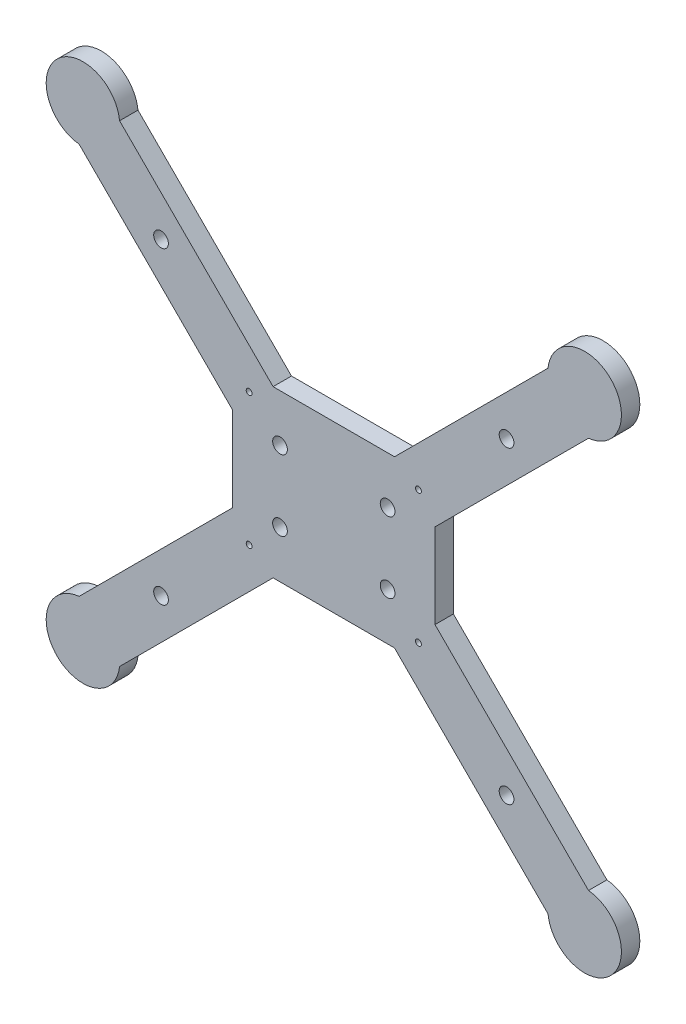
ISO-10303-21;
HEADER;
FILE_DESCRIPTION(('STEP AP214'),'2;1');
FILE_NAME('part.step','',(''),(''),'','','');
FILE_SCHEMA(('AUTOMOTIVE_DESIGN { 1 0 10303 214 1 1 1 1 }'));
ENDSEC;
DATA;
#1=APPLICATION_CONTEXT('core data for automotive mechanical design processes');
#2=APPLICATION_PROTOCOL_DEFINITION('international standard','automotive_design',2000,#1);
#3=PRODUCT_CONTEXT('',#1,'mechanical');
#4=PRODUCT('Part','Part','',(#3));
#5=PRODUCT_RELATED_PRODUCT_CATEGORY('part','',(#4));
#6=PRODUCT_DEFINITION_FORMATION('','',#4);
#7=PRODUCT_DEFINITION_CONTEXT('part definition',#1,'design');
#8=PRODUCT_DEFINITION('design','',#6,#7);
#9=PRODUCT_DEFINITION_SHAPE('','',#8);
#10=(LENGTH_UNIT() NAMED_UNIT(*) SI_UNIT(.MILLI.,.METRE.));
#11=(NAMED_UNIT(*) PLANE_ANGLE_UNIT() SI_UNIT($,.RADIAN.));
#12=(NAMED_UNIT(*) SI_UNIT($,.STERADIAN.) SOLID_ANGLE_UNIT());
#13=UNCERTAINTY_MEASURE_WITH_UNIT(LENGTH_MEASURE(1.E-05),#10,'distance_accuracy_value','');
#14=(GEOMETRIC_REPRESENTATION_CONTEXT(3) GLOBAL_UNCERTAINTY_ASSIGNED_CONTEXT((#13)) GLOBAL_UNIT_ASSIGNED_CONTEXT((#10,
#11,#12)) REPRESENTATION_CONTEXT('',''));
#15=CARTESIAN_POINT('',(0.,0.,0.));
#16=DIRECTION('',(0.,0.,1.));
#17=DIRECTION('',(1.,0.,0.));
#18=AXIS2_PLACEMENT_3D('',#15,#16,#17);
#19=CARTESIAN_POINT('',(55.,0.,10.));
#20=DIRECTION('',(-1.,0.,0.));
#21=DIRECTION('',(0.,0.,1.));
#22=AXIS2_PLACEMENT_3D('',#19,#20,#21);
#23=PLANE('',#22);
#24=DIRECTION('',(0.,1.,0.));
#25=VECTOR('',#24,1.);
#26=CARTESIAN_POINT('',(55.,0.,0.));
#27=LINE('',#26,#25);
#28=CARTESIAN_POINT('',(55.,-23.,0.));
#29=VERTEX_POINT('',#28);
#30=CARTESIAN_POINT('',(55.,23.,0.));
#31=VERTEX_POINT('',#30);
#32=EDGE_CURVE('E321',#29,#31,#27,.T.);
#33=ORIENTED_EDGE('',*,*,#32,.T.);
#34=DIRECTION('',(0.,0.,-1.));
#35=VECTOR('',#34,1.);
#36=CARTESIAN_POINT('',(55.,23.,10.));
#37=LINE('',#36,#35);
#38=CARTESIAN_POINT('',(55.,23.,10.));
#39=VERTEX_POINT('',#38);
#40=EDGE_CURVE('E194',#39,#31,#37,.T.);
#41=ORIENTED_EDGE('',*,*,#40,.F.);
#42=DIRECTION('',(0.,1.,0.));
#43=VECTOR('',#42,1.);
#44=CARTESIAN_POINT('',(55.,0.,10.));
#45=LINE('',#44,#43);
#46=CARTESIAN_POINT('',(55.,-23.,10.));
#47=VERTEX_POINT('',#46);
#48=EDGE_CURVE('E348',#47,#39,#45,.T.);
#49=ORIENTED_EDGE('',*,*,#48,.F.);
#50=DIRECTION('',(0.,0.,-1.));
#51=VECTOR('',#50,1.);
#52=CARTESIAN_POINT('',(55.,-23.,10.));
#53=LINE('',#52,#51);
#54=EDGE_CURVE('E377',#47,#29,#53,.T.);
#55=ORIENTED_EDGE('',*,*,#54,.T.);
#56=EDGE_LOOP('',(#33,#41,#49,#55));
#57=FACE_BOUND('',#56,.T.);
#58=ADVANCED_FACE('F175',(#57),#23,.F.);
#59=CARTESIAN_POINT('',(0.,45.,10.));
#60=DIRECTION('',(0.,-1.,0.));
#61=DIRECTION('',(1.,0.,0.));
#62=AXIS2_PLACEMENT_3D('',#59,#60,#61);
#63=PLANE('',#62);
#64=DIRECTION('',(-1.,0.,0.));
#65=VECTOR('',#64,1.);
#66=CARTESIAN_POINT('',(0.,45.,0.));
#67=LINE('',#66,#65);
#68=CARTESIAN_POINT('',(33.,45.,0.));
#69=VERTEX_POINT('',#68);
#70=CARTESIAN_POINT('',(-33.,45.,0.));
#71=VERTEX_POINT('',#70);
#72=EDGE_CURVE('E357',#69,#71,#67,.T.);
#73=ORIENTED_EDGE('',*,*,#72,.T.);
#74=DIRECTION('',(0.,0.,-1.));
#75=VECTOR('',#74,1.);
#76=CARTESIAN_POINT('',(-33.,45.,10.));
#77=LINE('',#76,#75);
#78=CARTESIAN_POINT('',(-33.,45.,10.));
#79=VERTEX_POINT('',#78);
#80=EDGE_CURVE('E393',#79,#71,#77,.T.);
#81=ORIENTED_EDGE('',*,*,#80,.F.);
#82=DIRECTION('',(-1.,0.,0.));
#83=VECTOR('',#82,1.);
#84=CARTESIAN_POINT('',(0.,45.,10.));
#85=LINE('',#84,#83);
#86=CARTESIAN_POINT('',(33.,45.,10.));
#87=VERTEX_POINT('',#86);
#88=EDGE_CURVE('E327',#87,#79,#85,.T.);
#89=ORIENTED_EDGE('',*,*,#88,.F.);
#90=DIRECTION('',(0.,0.,-1.));
#91=VECTOR('',#90,1.);
#92=CARTESIAN_POINT('',(33.,45.,10.));
#93=LINE('',#92,#91);
#94=EDGE_CURVE('E395',#87,#69,#93,.T.);
#95=ORIENTED_EDGE('',*,*,#94,.T.);
#96=EDGE_LOOP('',(#73,#81,#89,#95));
#97=FACE_BOUND('',#96,.T.);
#98=ADVANCED_FACE('F463',(#97),#63,.F.);
#99=CARTESIAN_POINT('',(15.9999999999997,-15.9999999999999,10.));
#100=DIRECTION('',(0.707106781186544,-0.707106781186551,0.));
#101=DIRECTION('',(0.707106781186551,0.707106781186544,0.));
#102=AXIS2_PLACEMENT_3D('',#99,#100,#101);
#103=PLANE('',#102);
#104=DIRECTION('',(-0.707106781186551,-0.707106781186544,0.));
#105=VECTOR('',#104,1.);
#106=CARTESIAN_POINT('',(15.9999999999997,-15.9999999999999,0.));
#107=LINE('',#106,#105);
#108=CARTESIAN_POINT('',(138.429085419138,106.429085419137,0.));
#109=VERTEX_POINT('',#108);
#110=EDGE_CURVE('E299',#109,#31,#107,.T.);
#111=ORIENTED_EDGE('',*,*,#110,.F.);
#112=DIRECTION('',(0.,0.,-1.));
#113=VECTOR('',#112,1.);
#114=CARTESIAN_POINT('',(138.429085419138,106.429085419137,10.));
#115=LINE('',#114,#113);
#116=CARTESIAN_POINT('',(138.429085419138,106.429085419137,10.));
#117=VERTEX_POINT('',#116);
#118=EDGE_CURVE('E12',#117,#109,#115,.T.);
#119=ORIENTED_EDGE('',*,*,#118,.F.);
#120=DIRECTION('',(-0.707106781186551,-0.707106781186544,0.));
#121=VECTOR('',#120,1.);
#122=CARTESIAN_POINT('',(15.9999999999997,-15.9999999999999,10.));
#123=LINE('',#122,#121);
#124=EDGE_CURVE('E317',#117,#39,#123,.T.);
#125=ORIENTED_EDGE('',*,*,#124,.T.);
#126=ORIENTED_EDGE('',*,*,#40,.T.);
#127=EDGE_LOOP('',(#111,#119,#125,#126));
#128=FACE_BOUND('',#127,.T.);
#129=ADVANCED_FACE('F436',(#128),#103,.T.);
#130=CARTESIAN_POINT('',(136.317279836453,126.317279836452,10.));
#131=DIRECTION('',(0.,0.,-1.));
#132=DIRECTION('',(-1.,0.,0.));
#133=AXIS2_PLACEMENT_3D('',#130,#131,#132);
#134=CYLINDRICAL_SURFACE('',#133,20.0000000000001);
#135=CARTESIAN_POINT('',(136.317279836453,126.317279836452,0.));
#136=DIRECTION('',(0.,0.,1.));
#137=DIRECTION('',(1.,0.,0.));
#138=AXIS2_PLACEMENT_3D('',#135,#136,#137);
#139=CIRCLE('',#138,20.0000000000001);
#140=CARTESIAN_POINT('',(116.429085419138,128.429085419137,0.));
#141=VERTEX_POINT('',#140);
#142=EDGE_CURVE('E351',#109,#141,#139,.T.);
#143=ORIENTED_EDGE('',*,*,#142,.T.);
#144=DIRECTION('',(0.,0.,-1.));
#145=VECTOR('',#144,1.);
#146=CARTESIAN_POINT('',(116.429085419138,128.429085419137,10.));
#147=LINE('',#146,#145);
#148=CARTESIAN_POINT('',(116.429085419138,128.429085419137,10.));
#149=VERTEX_POINT('',#148);
#150=EDGE_CURVE('E185',#149,#141,#147,.T.);
#151=ORIENTED_EDGE('',*,*,#150,.F.);
#152=CARTESIAN_POINT('',(136.317279836453,126.317279836452,10.));
#153=DIRECTION('',(0.,0.,1.));
#154=DIRECTION('',(1.,0.,0.));
#155=AXIS2_PLACEMENT_3D('',#152,#153,#154);
#156=CIRCLE('',#155,20.0000000000001);
#157=EDGE_CURVE('E320',#117,#149,#156,.T.);
#158=ORIENTED_EDGE('',*,*,#157,.F.);
#159=ORIENTED_EDGE('',*,*,#118,.T.);
#160=EDGE_LOOP('',(#143,#151,#158,#159));
#161=FACE_BOUND('',#160,.T.);
#162=ADVANCED_FACE('F443',(#161),#134,.T.);
#163=CARTESIAN_POINT('',(-6.00000000000019,6.00000000000025,10.));
#164=DIRECTION('',(-0.707106781186544,0.707106781186551,0.));
#165=DIRECTION('',(-0.707106781186551,-0.707106781186544,0.));
#166=AXIS2_PLACEMENT_3D('',#163,#164,#165);
#167=PLANE('',#166);
#168=DIRECTION('',(0.707106781186551,0.707106781186544,0.));
#169=VECTOR('',#168,1.);
#170=CARTESIAN_POINT('',(-6.00000000000019,6.00000000000025,0.));
#171=LINE('',#170,#169);
#172=EDGE_CURVE('E354',#69,#141,#171,.T.);
#173=ORIENTED_EDGE('',*,*,#172,.F.);
#174=ORIENTED_EDGE('',*,*,#94,.F.);
#175=DIRECTION('',(0.707106781186551,0.707106781186544,0.));
#176=VECTOR('',#175,1.);
#177=CARTESIAN_POINT('',(-6.00000000000019,6.00000000000025,10.));
#178=LINE('',#177,#176);
#179=EDGE_CURVE('E324',#87,#149,#178,.T.);
#180=ORIENTED_EDGE('',*,*,#179,.T.);
#181=ORIENTED_EDGE('',*,*,#150,.T.);
#182=EDGE_LOOP('',(#173,#174,#180,#181));
#183=FACE_BOUND('',#182,.T.);
#184=ADVANCED_FACE('F503',(#183),#167,.T.);
#185=CARTESIAN_POINT('',(0.,0.,0.));
#186=DIRECTION('',(0.,0.,1.));
#187=DIRECTION('',(1.,0.,0.));
#188=AXIS2_PLACEMENT_3D('',#185,#186,#187);
#189=PLANE('',#188);
#190=CARTESIAN_POINT('',(29.2383992870816,-19.2383992870817,0.));
#191=DIRECTION('',(0.,0.,-1.));
#192=DIRECTION('',(1.,0.,0.));
#193=AXIS2_PLACEMENT_3D('',#190,#191,#192);
#194=CIRCLE('',#193,3.99999999999979);
#195=CARTESIAN_POINT('',(33.2383992870814,-19.2383992870817,0.));
#196=VERTEX_POINT('',#195);
#197=EDGE_CURVE('E616',#196,#196,#194,.T.);
#198=ORIENTED_EDGE('',*,*,#197,.F.);
#199=EDGE_LOOP('',(#198));
#200=FACE_BOUND('',#199,.T.);
#201=CARTESIAN_POINT('',(-29.2383992870816,-19.2383992870817,0.));
#202=DIRECTION('',(0.,0.,-1.));
#203=DIRECTION('',(-1.,0.,0.));
#204=AXIS2_PLACEMENT_3D('',#201,#202,#203);
#205=CIRCLE('',#204,3.9999999999998);
#206=CARTESIAN_POINT('',(-33.2383992870814,-19.2383992870817,0.));
#207=VERTEX_POINT('',#206);
#208=EDGE_CURVE('E604',#207,#207,#205,.T.);
#209=ORIENTED_EDGE('',*,*,#208,.F.);
#210=EDGE_LOOP('',(#209));
#211=FACE_BOUND('',#210,.T.);
#212=CARTESIAN_POINT('',(-93.8908729652604,-83.8908729652599,0.));
#213=DIRECTION('',(0.,0.,-1.));
#214=DIRECTION('',(-1.,0.,0.));
#215=AXIS2_PLACEMENT_3D('',#212,#213,#214);
#216=CIRCLE('',#215,4.00000000000017);
#217=CARTESIAN_POINT('',(-97.8908729652606,-83.8908729652599,0.));
#218=VERTEX_POINT('',#217);
#219=EDGE_CURVE('E605',#218,#218,#216,.T.);
#220=ORIENTED_EDGE('',*,*,#219,.F.);
#221=EDGE_LOOP('',(#220));
#222=FACE_BOUND('',#221,.T.);
#223=CARTESIAN_POINT('',(46.,36.,0.));
#224=DIRECTION('',(0.,0.,-1.));
#225=DIRECTION('',(-1.,0.,0.));
#226=AXIS2_PLACEMENT_3D('',#223,#224,#225);
#227=CIRCLE('',#226,1.6);
#228=CARTESIAN_POINT('',(44.4,36.,0.));
#229=VERTEX_POINT('',#228);
#230=EDGE_CURVE('E587',#229,#229,#227,.T.);
#231=ORIENTED_EDGE('',*,*,#230,.F.);
#232=EDGE_LOOP('',(#231));
#233=FACE_BOUND('',#232,.T.);
#234=CARTESIAN_POINT('',(-29.2383992870816,19.2383992870817,0.));
#235=DIRECTION('',(0.,0.,-1.));
#236=DIRECTION('',(1.,0.,0.));
#237=AXIS2_PLACEMENT_3D('',#234,#235,#236);
#238=CIRCLE('',#237,3.9999999999998);
#239=CARTESIAN_POINT('',(-25.2383992870818,19.2383992870817,0.));
#240=VERTEX_POINT('',#239);
#241=EDGE_CURVE('E637',#240,#240,#238,.T.);
#242=ORIENTED_EDGE('',*,*,#241,.F.);
#243=EDGE_LOOP('',(#242));
#244=FACE_BOUND('',#243,.T.);
#245=CARTESIAN_POINT('',(93.8908729652604,-83.8908729652599,0.));
#246=DIRECTION('',(0.,0.,-1.));
#247=DIRECTION('',(1.,0.,0.));
#248=AXIS2_PLACEMENT_3D('',#245,#246,#247);
#249=CIRCLE('',#248,4.00000000000014);
#250=CARTESIAN_POINT('',(97.8908729652606,-83.8908729652599,0.));
#251=VERTEX_POINT('',#250);
#252=EDGE_CURVE('E314',#251,#251,#249,.T.);
#253=ORIENTED_EDGE('',*,*,#252,.F.);
#254=EDGE_LOOP('',(#253));
#255=FACE_BOUND('',#254,.T.);
#256=CARTESIAN_POINT('',(93.8908729652604,83.8908729652599,0.));
#257=DIRECTION('',(0.,0.,-1.));
#258=DIRECTION('',(-1.,0.,0.));
#259=AXIS2_PLACEMENT_3D('',#256,#257,#258);
#260=CIRCLE('',#259,4.00000000000014);
#261=CARTESIAN_POINT('',(89.8908729652603,83.8908729652599,0.));
#262=VERTEX_POINT('',#261);
#263=EDGE_CURVE('E627',#262,#262,#260,.T.);
#264=ORIENTED_EDGE('',*,*,#263,.F.);
#265=EDGE_LOOP('',(#264));
#266=FACE_BOUND('',#265,.T.);
#267=CARTESIAN_POINT('',(29.2383992870816,19.2383992870818,0.));
#268=DIRECTION('',(0.,0.,-1.));
#269=DIRECTION('',(-1.,0.,0.));
#270=AXIS2_PLACEMENT_3D('',#267,#268,#269);
#271=CIRCLE('',#270,3.99999999999974);
#272=CARTESIAN_POINT('',(25.2383992870818,19.2383992870818,0.));
#273=VERTEX_POINT('',#272);
#274=EDGE_CURVE('E615',#273,#273,#271,.T.);
#275=ORIENTED_EDGE('',*,*,#274,.F.);
#276=EDGE_LOOP('',(#275));
#277=FACE_BOUND('',#276,.T.);
#278=CARTESIAN_POINT('',(-46.,36.,0.));
#279=DIRECTION('',(0.,0.,-1.));
#280=DIRECTION('',(-1.,0.,0.));
#281=AXIS2_PLACEMENT_3D('',#278,#279,#280);
#282=CIRCLE('',#281,1.6);
#283=CARTESIAN_POINT('',(-47.6,36.,0.));
#284=VERTEX_POINT('',#283);
#285=EDGE_CURVE('E583',#284,#284,#282,.T.);
#286=ORIENTED_EDGE('',*,*,#285,.F.);
#287=EDGE_LOOP('',(#286));
#288=FACE_BOUND('',#287,.T.);
#289=CARTESIAN_POINT('',(-46.,-36.,0.));
#290=DIRECTION('',(0.,0.,-1.));
#291=DIRECTION('',(-1.,0.,0.));
#292=AXIS2_PLACEMENT_3D('',#289,#290,#291);
#293=CIRCLE('',#292,1.6);
#294=CARTESIAN_POINT('',(-47.6,-36.,0.));
#295=VERTEX_POINT('',#294);
#296=EDGE_CURVE('E590',#295,#295,#293,.T.);
#297=ORIENTED_EDGE('',*,*,#296,.F.);
#298=EDGE_LOOP('',(#297));
#299=FACE_BOUND('',#298,.T.);
#300=CARTESIAN_POINT('',(46.,-36.,0.));
#301=DIRECTION('',(0.,0.,-1.));
#302=DIRECTION('',(-1.,0.,0.));
#303=AXIS2_PLACEMENT_3D('',#300,#301,#302);
#304=CIRCLE('',#303,1.6);
#305=CARTESIAN_POINT('',(44.4,-36.,0.));
#306=VERTEX_POINT('',#305);
#307=EDGE_CURVE('E598',#306,#306,#304,.T.);
#308=ORIENTED_EDGE('',*,*,#307,.F.);
#309=EDGE_LOOP('',(#308));
#310=FACE_BOUND('',#309,.T.);
#311=CARTESIAN_POINT('',(-93.8908729652604,83.8908729652599,0.));
#312=DIRECTION('',(0.,0.,-1.));
#313=DIRECTION('',(1.,0.,0.));
#314=AXIS2_PLACEMENT_3D('',#311,#312,#313);
#315=CIRCLE('',#314,4.00000000000017);
#316=CARTESIAN_POINT('',(-89.8908729652603,83.8908729652599,0.));
#317=VERTEX_POINT('',#316);
#318=EDGE_CURVE('E306',#317,#317,#315,.T.);
#319=ORIENTED_EDGE('',*,*,#318,.F.);
#320=EDGE_LOOP('',(#319));
#321=FACE_BOUND('',#320,.T.);
#322=ORIENTED_EDGE('',*,*,#110,.T.);
#323=ORIENTED_EDGE('',*,*,#32,.F.);
#324=DIRECTION('',(-0.707106781186562,0.707106781186533,0.));
#325=VECTOR('',#324,1.);
#326=CARTESIAN_POINT('',(15.9999999999989,15.9999999999995,0.));
#327=LINE('',#326,#325);
#328=CARTESIAN_POINT('',(138.429085419139,-106.429085419136,0.));
#329=VERTEX_POINT('',#328);
#330=EDGE_CURVE('E372',#329,#29,#327,.T.);
#331=ORIENTED_EDGE('',*,*,#330,.F.);
#332=CARTESIAN_POINT('',(136.317279836455,-126.317279836451,0.));
#333=DIRECTION('',(0.,0.,1.));
#334=DIRECTION('',(1.,0.,0.));
#335=AXIS2_PLACEMENT_3D('',#332,#333,#334);
#336=CIRCLE('',#335,19.9999999999999);
#337=CARTESIAN_POINT('',(116.429085419139,-128.429085419136,0.));
#338=VERTEX_POINT('',#337);
#339=EDGE_CURVE('E370',#338,#329,#336,.T.);
#340=ORIENTED_EDGE('',*,*,#339,.F.);
#341=DIRECTION('',(0.707106781186562,-0.707106781186534,0.));
#342=VECTOR('',#341,1.);
#343=CARTESIAN_POINT('',(-6.00000000000065,-6.00000000000089,0.));
#344=LINE('',#343,#342);
#345=CARTESIAN_POINT('',(33.,-45.,0.));
#346=VERTEX_POINT('',#345);
#347=EDGE_CURVE('E368',#346,#338,#344,.T.);
#348=ORIENTED_EDGE('',*,*,#347,.F.);
#349=DIRECTION('',(-1.,0.,0.));
#350=VECTOR('',#349,1.);
#351=CARTESIAN_POINT('',(55.,-45.,0.));
#352=LINE('',#351,#350);
#353=CARTESIAN_POINT('',(-33.,-45.,0.));
#354=VERTEX_POINT('',#353);
#355=EDGE_CURVE('E179',#346,#354,#352,.T.);
#356=ORIENTED_EDGE('',*,*,#355,.T.);
#357=DIRECTION('',(0.707106781186551,0.707106781186544,0.));
#358=VECTOR('',#357,1.);
#359=CARTESIAN_POINT('',(6.00000000000016,-6.00000000000021,0.));
#360=LINE('',#359,#358);
#361=CARTESIAN_POINT('',(-116.429085419138,-128.429085419137,0.));
#362=VERTEX_POINT('',#361);
#363=EDGE_CURVE('E271',#362,#354,#360,.T.);
#364=ORIENTED_EDGE('',*,*,#363,.F.);
#365=CARTESIAN_POINT('',(-136.317279836453,-126.317279836453,0.));
#366=DIRECTION('',(0.,0.,1.));
#367=DIRECTION('',(1.,0.,0.));
#368=AXIS2_PLACEMENT_3D('',#365,#366,#367);
#369=CIRCLE('',#368,20.);
#370=CARTESIAN_POINT('',(-138.429085419138,-106.429085419137,0.));
#371=VERTEX_POINT('',#370);
#372=EDGE_CURVE('E277',#371,#362,#369,.T.);
#373=ORIENTED_EDGE('',*,*,#372,.F.);
#374=DIRECTION('',(-0.707106781186551,-0.707106781186544,0.));
#375=VECTOR('',#374,1.);
#376=CARTESIAN_POINT('',(-15.9999999999997,15.9999999999999,0.));
#377=LINE('',#376,#375);
#378=CARTESIAN_POINT('',(-55.,-23.,0.));
#379=VERTEX_POINT('',#378);
#380=EDGE_CURVE('E262',#379,#371,#377,.T.);
#381=ORIENTED_EDGE('',*,*,#380,.F.);
#382=DIRECTION('',(0.,1.,0.));
#383=VECTOR('',#382,1.);
#384=CARTESIAN_POINT('',(-55.,-45.,0.));
#385=LINE('',#384,#383);
#386=CARTESIAN_POINT('',(-55.,23.,0.));
#387=VERTEX_POINT('',#386);
#388=EDGE_CURVE('E301',#379,#387,#385,.T.);
#389=ORIENTED_EDGE('',*,*,#388,.T.);
#390=DIRECTION('',(-0.707106781186561,0.707106781186534,0.));
#391=VECTOR('',#390,1.);
#392=CARTESIAN_POINT('',(-15.9999999999989,-15.9999999999996,0.));
#393=LINE('',#392,#391);
#394=CARTESIAN_POINT('',(-138.429085419139,106.429085419136,0.));
#395=VERTEX_POINT('',#394);
#396=EDGE_CURVE('E366',#387,#395,#393,.T.);
#397=ORIENTED_EDGE('',*,*,#396,.T.);
#398=CARTESIAN_POINT('',(-136.317279836455,126.317279836451,0.));
#399=DIRECTION('',(0.,0.,1.));
#400=DIRECTION('',(1.,0.,0.));
#401=AXIS2_PLACEMENT_3D('',#398,#399,#400);
#402=CIRCLE('',#401,20.);
#403=CARTESIAN_POINT('',(-116.429085419139,128.429085419136,0.));
#404=VERTEX_POINT('',#403);
#405=EDGE_CURVE('E363',#404,#395,#402,.T.);
#406=ORIENTED_EDGE('',*,*,#405,.F.);
#407=DIRECTION('',(0.707106781186562,-0.707106781186534,0.));
#408=VECTOR('',#407,1.);
#409=CARTESIAN_POINT('',(6.00000000000064,6.00000000000088,0.));
#410=LINE('',#409,#408);
#411=EDGE_CURVE('E360',#404,#71,#410,.T.);
#412=ORIENTED_EDGE('',*,*,#411,.T.);
#413=ORIENTED_EDGE('',*,*,#72,.F.);
#414=ORIENTED_EDGE('',*,*,#172,.T.);
#415=ORIENTED_EDGE('',*,*,#142,.F.);
#416=EDGE_LOOP('',(#322,#323,#331,#340,#348,#356,#364,#373,#381,#389,#397,#406,#412,#413,#414,#415));
#417=FACE_BOUND('',#416,.T.);
#418=ADVANCED_FACE('F282',(#200,#211,#222,#233,#244,#255,#266,#277,#288,#299,#310,#321,#417),
#189,.F.);
#419=CARTESIAN_POINT('',(0.,0.,10.));
#420=DIRECTION('',(0.,0.,1.));
#421=DIRECTION('',(1.,0.,0.));
#422=AXIS2_PLACEMENT_3D('',#419,#420,#421);
#423=PLANE('',#422);
#424=CARTESIAN_POINT('',(29.2383992870816,-19.2383992870817,10.));
#425=DIRECTION('',(0.,0.,-1.));
#426=DIRECTION('',(1.,0.,0.));
#427=AXIS2_PLACEMENT_3D('',#424,#425,#426);
#428=CIRCLE('',#427,3.99999999999979);
#429=CARTESIAN_POINT('',(33.2383992870814,-19.2383992870817,10.));
#430=VERTEX_POINT('',#429);
#431=EDGE_CURVE('E613',#430,#430,#428,.T.);
#432=ORIENTED_EDGE('',*,*,#431,.T.);
#433=EDGE_LOOP('',(#432));
#434=FACE_BOUND('',#433,.T.);
#435=CARTESIAN_POINT('',(-29.2383992870816,-19.2383992870817,10.));
#436=DIRECTION('',(0.,0.,-1.));
#437=DIRECTION('',(-1.,0.,0.));
#438=AXIS2_PLACEMENT_3D('',#435,#436,#437);
#439=CIRCLE('',#438,3.9999999999998);
#440=CARTESIAN_POINT('',(-33.2383992870814,-19.2383992870817,10.));
#441=VERTEX_POINT('',#440);
#442=EDGE_CURVE('E619',#441,#441,#439,.T.);
#443=ORIENTED_EDGE('',*,*,#442,.T.);
#444=EDGE_LOOP('',(#443));
#445=FACE_BOUND('',#444,.T.);
#446=CARTESIAN_POINT('',(-93.8908729652604,-83.8908729652599,10.));
#447=DIRECTION('',(0.,0.,-1.));
#448=DIRECTION('',(-1.,0.,0.));
#449=AXIS2_PLACEMENT_3D('',#446,#447,#448);
#450=CIRCLE('',#449,4.00000000000017);
#451=CARTESIAN_POINT('',(-97.8908729652606,-83.8908729652599,10.));
#452=VERTEX_POINT('',#451);
#453=EDGE_CURVE('E601',#452,#452,#450,.T.);
#454=ORIENTED_EDGE('',*,*,#453,.T.);
#455=EDGE_LOOP('',(#454));
#456=FACE_BOUND('',#455,.T.);
#457=CARTESIAN_POINT('',(46.,36.,10.));
#458=DIRECTION('',(0.,0.,-1.));
#459=DIRECTION('',(-1.,0.,0.));
#460=AXIS2_PLACEMENT_3D('',#457,#458,#459);
#461=CIRCLE('',#460,1.6);
#462=CARTESIAN_POINT('',(44.4,36.,10.));
#463=VERTEX_POINT('',#462);
#464=EDGE_CURVE('E608',#463,#463,#461,.T.);
#465=ORIENTED_EDGE('',*,*,#464,.T.);
#466=EDGE_LOOP('',(#465));
#467=FACE_BOUND('',#466,.T.);
#468=CARTESIAN_POINT('',(-29.2383992870816,19.2383992870817,10.));
#469=DIRECTION('',(0.,0.,-1.));
#470=DIRECTION('',(1.,0.,0.));
#471=AXIS2_PLACEMENT_3D('',#468,#469,#470);
#472=CIRCLE('',#471,3.9999999999998);
#473=CARTESIAN_POINT('',(-25.2383992870818,19.2383992870817,10.));
#474=VERTEX_POINT('',#473);
#475=EDGE_CURVE('E311',#474,#474,#472,.T.);
#476=ORIENTED_EDGE('',*,*,#475,.T.);
#477=EDGE_LOOP('',(#476));
#478=FACE_BOUND('',#477,.T.);
#479=CARTESIAN_POINT('',(93.8908729652604,-83.8908729652599,10.));
#480=DIRECTION('',(0.,0.,-1.));
#481=DIRECTION('',(1.,0.,0.));
#482=AXIS2_PLACEMENT_3D('',#479,#480,#481);
#483=CIRCLE('',#482,4.00000000000014);
#484=CARTESIAN_POINT('',(97.8908729652606,-83.8908729652599,10.));
#485=VERTEX_POINT('',#484);
#486=EDGE_CURVE('E639',#485,#485,#483,.T.);
#487=ORIENTED_EDGE('',*,*,#486,.T.);
#488=EDGE_LOOP('',(#487));
#489=FACE_BOUND('',#488,.T.);
#490=CARTESIAN_POINT('',(93.8908729652604,83.8908729652599,10.));
#491=DIRECTION('',(0.,0.,-1.));
#492=DIRECTION('',(-1.,0.,0.));
#493=AXIS2_PLACEMENT_3D('',#490,#491,#492);
#494=CIRCLE('',#493,4.00000000000014);
#495=CARTESIAN_POINT('',(89.8908729652603,83.8908729652599,10.));
#496=VERTEX_POINT('',#495);
#497=EDGE_CURVE('E624',#496,#496,#494,.T.);
#498=ORIENTED_EDGE('',*,*,#497,.T.);
#499=EDGE_LOOP('',(#498));
#500=FACE_BOUND('',#499,.T.);
#501=CARTESIAN_POINT('',(29.2383992870816,19.2383992870818,10.));
#502=DIRECTION('',(0.,0.,-1.));
#503=DIRECTION('',(-1.,0.,0.));
#504=AXIS2_PLACEMENT_3D('',#501,#502,#503);
#505=CIRCLE('',#504,3.99999999999974);
#506=CARTESIAN_POINT('',(25.2383992870818,19.2383992870818,10.));
#507=VERTEX_POINT('',#506);
#508=EDGE_CURVE('E630',#507,#507,#505,.T.);
#509=ORIENTED_EDGE('',*,*,#508,.T.);
#510=EDGE_LOOP('',(#509));
#511=FACE_BOUND('',#510,.T.);
#512=CARTESIAN_POINT('',(-46.,36.,10.));
#513=DIRECTION('',(0.,0.,-1.));
#514=DIRECTION('',(-1.,0.,0.));
#515=AXIS2_PLACEMENT_3D('',#512,#513,#514);
#516=CIRCLE('',#515,1.6);
#517=CARTESIAN_POINT('',(-47.6,36.,10.));
#518=VERTEX_POINT('',#517);
#519=EDGE_CURVE('E580',#518,#518,#516,.T.);
#520=ORIENTED_EDGE('',*,*,#519,.T.);
#521=EDGE_LOOP('',(#520));
#522=FACE_BOUND('',#521,.T.);
#523=CARTESIAN_POINT('',(-46.,-36.,10.));
#524=DIRECTION('',(0.,0.,-1.));
#525=DIRECTION('',(-1.,0.,0.));
#526=AXIS2_PLACEMENT_3D('',#523,#524,#525);
#527=CIRCLE('',#526,1.6);
#528=CARTESIAN_POINT('',(-47.6,-36.,10.));
#529=VERTEX_POINT('',#528);
#530=EDGE_CURVE('E585',#529,#529,#527,.T.);
#531=ORIENTED_EDGE('',*,*,#530,.T.);
#532=EDGE_LOOP('',(#531));
#533=FACE_BOUND('',#532,.T.);
#534=CARTESIAN_POINT('',(46.,-36.,10.));
#535=DIRECTION('',(0.,0.,-1.));
#536=DIRECTION('',(-1.,0.,0.));
#537=AXIS2_PLACEMENT_3D('',#534,#535,#536);
#538=CIRCLE('',#537,1.6);
#539=CARTESIAN_POINT('',(44.4,-36.,10.));
#540=VERTEX_POINT('',#539);
#541=EDGE_CURVE('E595',#540,#540,#538,.T.);
#542=ORIENTED_EDGE('',*,*,#541,.T.);
#543=EDGE_LOOP('',(#542));
#544=FACE_BOUND('',#543,.T.);
#545=CARTESIAN_POINT('',(-93.8908729652604,83.8908729652599,10.));
#546=DIRECTION('',(0.,0.,-1.));
#547=DIRECTION('',(1.,0.,0.));
#548=AXIS2_PLACEMENT_3D('',#545,#546,#547);
#549=CIRCLE('',#548,4.00000000000017);
#550=CARTESIAN_POINT('',(-89.8908729652603,83.8908729652599,10.));
#551=VERTEX_POINT('',#550);
#552=EDGE_CURVE('E302',#551,#551,#549,.T.);
#553=ORIENTED_EDGE('',*,*,#552,.T.);
#554=EDGE_LOOP('',(#553));
#555=FACE_BOUND('',#554,.T.);
#556=ORIENTED_EDGE('',*,*,#179,.F.);
#557=ORIENTED_EDGE('',*,*,#88,.T.);
#558=DIRECTION('',(0.707106781186562,-0.707106781186534,0.));
#559=VECTOR('',#558,1.);
#560=CARTESIAN_POINT('',(6.00000000000064,6.00000000000088,10.));
#561=LINE('',#560,#559);
#562=CARTESIAN_POINT('',(-116.429085419139,128.429085419136,10.));
#563=VERTEX_POINT('',#562);
#564=EDGE_CURVE('E330',#563,#79,#561,.T.);
#565=ORIENTED_EDGE('',*,*,#564,.F.);
#566=CARTESIAN_POINT('',(-136.317279836455,126.317279836451,10.));
#567=DIRECTION('',(0.,0.,1.));
#568=DIRECTION('',(1.,0.,0.));
#569=AXIS2_PLACEMENT_3D('',#566,#567,#568);
#570=CIRCLE('',#569,20.);
#571=CARTESIAN_POINT('',(-138.429085419139,106.429085419136,10.));
#572=VERTEX_POINT('',#571);
#573=EDGE_CURVE('E333',#563,#572,#570,.T.);
#574=ORIENTED_EDGE('',*,*,#573,.T.);
#575=DIRECTION('',(-0.707106781186561,0.707106781186534,0.));
#576=VECTOR('',#575,1.);
#577=CARTESIAN_POINT('',(-15.9999999999989,-15.9999999999996,10.));
#578=LINE('',#577,#576);
#579=CARTESIAN_POINT('',(-55.,23.,10.));
#580=VERTEX_POINT('',#579);
#581=EDGE_CURVE('E336',#580,#572,#578,.T.);
#582=ORIENTED_EDGE('',*,*,#581,.F.);
#583=DIRECTION('',(0.,1.,0.));
#584=VECTOR('',#583,1.);
#585=CARTESIAN_POINT('',(-55.,-45.,10.));
#586=LINE('',#585,#584);
#587=CARTESIAN_POINT('',(-55.,-23.,10.));
#588=VERTEX_POINT('',#587);
#589=EDGE_CURVE('E288',#588,#580,#586,.T.);
#590=ORIENTED_EDGE('',*,*,#589,.F.);
#591=DIRECTION('',(-0.707106781186551,-0.707106781186544,0.));
#592=VECTOR('',#591,1.);
#593=CARTESIAN_POINT('',(-15.9999999999997,15.9999999999999,10.));
#594=LINE('',#593,#592);
#595=CARTESIAN_POINT('',(-138.429085419138,-106.429085419137,10.));
#596=VERTEX_POINT('',#595);
#597=EDGE_CURVE('E279',#588,#596,#594,.T.);
#598=ORIENTED_EDGE('',*,*,#597,.T.);
#599=CARTESIAN_POINT('',(-136.317279836453,-126.317279836453,10.));
#600=DIRECTION('',(0.,0.,1.));
#601=DIRECTION('',(1.,0.,0.));
#602=AXIS2_PLACEMENT_3D('',#599,#600,#601);
#603=CIRCLE('',#602,20.);
#604=CARTESIAN_POINT('',(-116.429085419138,-128.429085419137,10.));
#605=VERTEX_POINT('',#604);
#606=EDGE_CURVE('E270',#596,#605,#603,.T.);
#607=ORIENTED_EDGE('',*,*,#606,.T.);
#608=DIRECTION('',(0.707106781186551,0.707106781186544,0.));
#609=VECTOR('',#608,1.);
#610=CARTESIAN_POINT('',(6.00000000000016,-6.00000000000021,10.));
#611=LINE('',#610,#609);
#612=CARTESIAN_POINT('',(-33.,-45.,10.));
#613=VERTEX_POINT('',#612);
#614=EDGE_CURVE('E398',#605,#613,#611,.T.);
#615=ORIENTED_EDGE('',*,*,#614,.T.);
#616=DIRECTION('',(-1.,0.,0.));
#617=VECTOR('',#616,1.);
#618=CARTESIAN_POINT('',(55.,-45.,10.));
#619=LINE('',#618,#617);
#620=CARTESIAN_POINT('',(33.,-45.,10.));
#621=VERTEX_POINT('',#620);
#622=EDGE_CURVE('E285',#621,#613,#619,.T.);
#623=ORIENTED_EDGE('',*,*,#622,.F.);
#624=DIRECTION('',(0.707106781186562,-0.707106781186534,0.));
#625=VECTOR('',#624,1.);
#626=CARTESIAN_POINT('',(-6.00000000000065,-6.00000000000089,10.));
#627=LINE('',#626,#625);
#628=CARTESIAN_POINT('',(116.429085419139,-128.429085419136,10.));
#629=VERTEX_POINT('',#628);
#630=EDGE_CURVE('E339',#621,#629,#627,.T.);
#631=ORIENTED_EDGE('',*,*,#630,.T.);
#632=CARTESIAN_POINT('',(136.317279836455,-126.317279836451,10.));
#633=DIRECTION('',(0.,0.,1.));
#634=DIRECTION('',(1.,0.,0.));
#635=AXIS2_PLACEMENT_3D('',#632,#633,#634);
#636=CIRCLE('',#635,19.9999999999999);
#637=CARTESIAN_POINT('',(138.429085419139,-106.429085419136,10.));
#638=VERTEX_POINT('',#637);
#639=EDGE_CURVE('E342',#629,#638,#636,.T.);
#640=ORIENTED_EDGE('',*,*,#639,.T.);
#641=DIRECTION('',(-0.707106781186562,0.707106781186533,0.));
#642=VECTOR('',#641,1.);
#643=CARTESIAN_POINT('',(15.9999999999989,15.9999999999995,10.));
#644=LINE('',#643,#642);
#645=EDGE_CURVE('E345',#638,#47,#644,.T.);
#646=ORIENTED_EDGE('',*,*,#645,.T.);
#647=ORIENTED_EDGE('',*,*,#48,.T.);
#648=ORIENTED_EDGE('',*,*,#124,.F.);
#649=ORIENTED_EDGE('',*,*,#157,.T.);
#650=EDGE_LOOP('',(#556,#557,#565,#574,#582,#590,#598,#607,#615,#623,#631,#640,#646,#647,#648,#649));
#651=FACE_BOUND('',#650,.T.);
#652=ADVANCED_FACE('F404',(#434,#445,#456,#467,#478,#489,#500,#511,#522,#533,#544,#555,#651),
#423,.T.);
#653=CARTESIAN_POINT('',(-136.317279836455,126.317279836451,10.));
#654=DIRECTION('',(0.,0.,-1.));
#655=DIRECTION('',(-1.,0.,0.));
#656=AXIS2_PLACEMENT_3D('',#653,#654,#655);
#657=CYLINDRICAL_SURFACE('',#656,20.);
#658=ORIENTED_EDGE('',*,*,#405,.T.);
#659=DIRECTION('',(0.,0.,-1.));
#660=VECTOR('',#659,1.);
#661=CARTESIAN_POINT('',(-138.429085419139,106.429085419136,10.));
#662=LINE('',#661,#660);
#663=EDGE_CURVE('E389',#572,#395,#662,.T.);
#664=ORIENTED_EDGE('',*,*,#663,.F.);
#665=ORIENTED_EDGE('',*,*,#573,.F.);
#666=DIRECTION('',(0.,0.,-1.));
#667=VECTOR('',#666,1.);
#668=CARTESIAN_POINT('',(-116.429085419139,128.429085419136,10.));
#669=LINE('',#668,#667);
#670=EDGE_CURVE('E391',#563,#404,#669,.T.);
#671=ORIENTED_EDGE('',*,*,#670,.T.);
#672=EDGE_LOOP('',(#658,#664,#665,#671));
#673=FACE_BOUND('',#672,.T.);
#674=ADVANCED_FACE('F460',(#673),#657,.T.);
#675=CARTESIAN_POINT('',(-15.9999999999989,-15.9999999999996,10.));
#676=DIRECTION('',(-0.707106781186534,-0.707106781186561,0.));
#677=DIRECTION('',(0.707106781186561,-0.707106781186534,0.));
#678=AXIS2_PLACEMENT_3D('',#675,#676,#677);
#679=PLANE('',#678);
#680=ORIENTED_EDGE('',*,*,#396,.F.);
#681=DIRECTION('',(0.,0.,-1.));
#682=VECTOR('',#681,1.);
#683=CARTESIAN_POINT('',(-55.,23.,10.));
#684=LINE('',#683,#682);
#685=EDGE_CURVE('E387',#580,#387,#684,.T.);
#686=ORIENTED_EDGE('',*,*,#685,.F.);
#687=ORIENTED_EDGE('',*,*,#581,.T.);
#688=ORIENTED_EDGE('',*,*,#663,.T.);
#689=EDGE_LOOP('',(#680,#686,#687,#688));
#690=FACE_BOUND('',#689,.T.);
#691=ADVANCED_FACE('F466',(#690),#679,.T.);
#692=CARTESIAN_POINT('',(6.00000000000064,6.00000000000088,10.));
#693=DIRECTION('',(0.707106781186534,0.707106781186562,0.));
#694=DIRECTION('',(-0.707106781186562,0.707106781186534,0.));
#695=AXIS2_PLACEMENT_3D('',#692,#693,#694);
#696=PLANE('',#695);
#697=ORIENTED_EDGE('',*,*,#411,.F.);
#698=ORIENTED_EDGE('',*,*,#670,.F.);
#699=ORIENTED_EDGE('',*,*,#564,.T.);
#700=ORIENTED_EDGE('',*,*,#80,.T.);
#701=EDGE_LOOP('',(#697,#698,#699,#700));
#702=FACE_BOUND('',#701,.T.);
#703=ADVANCED_FACE('F455',(#702),#696,.T.);
#704=CARTESIAN_POINT('',(-6.00000000000065,-6.00000000000089,10.));
#705=DIRECTION('',(0.707106781186534,0.707106781186562,0.));
#706=DIRECTION('',(-0.707106781186562,0.707106781186534,0.));
#707=AXIS2_PLACEMENT_3D('',#704,#705,#706);
#708=PLANE('',#707);
#709=ORIENTED_EDGE('',*,*,#347,.T.);
#710=DIRECTION('',(0.,0.,-1.));
#711=VECTOR('',#710,1.);
#712=CARTESIAN_POINT('',(116.429085419139,-128.429085419136,10.));
#713=LINE('',#712,#711);
#714=EDGE_CURVE('E382',#629,#338,#713,.T.);
#715=ORIENTED_EDGE('',*,*,#714,.F.);
#716=ORIENTED_EDGE('',*,*,#630,.F.);
#717=DIRECTION('',(0.,0.,-1.));
#718=VECTOR('',#717,1.);
#719=CARTESIAN_POINT('',(33.,-45.,10.));
#720=LINE('',#719,#718);
#721=EDGE_CURVE('E385',#621,#346,#720,.T.);
#722=ORIENTED_EDGE('',*,*,#721,.T.);
#723=EDGE_LOOP('',(#709,#715,#716,#722));
#724=FACE_BOUND('',#723,.T.);
#725=ADVANCED_FACE('F473',(#724),#708,.F.);
#726=CARTESIAN_POINT('',(136.317279836455,-126.317279836451,10.));
#727=DIRECTION('',(0.,0.,-1.));
#728=DIRECTION('',(-1.,0.,0.));
#729=AXIS2_PLACEMENT_3D('',#726,#727,#728);
#730=CYLINDRICAL_SURFACE('',#729,19.9999999999999);
#731=ORIENTED_EDGE('',*,*,#339,.T.);
#732=DIRECTION('',(0.,0.,-1.));
#733=VECTOR('',#732,1.);
#734=CARTESIAN_POINT('',(138.429085419139,-106.429085419136,10.));
#735=LINE('',#734,#733);
#736=EDGE_CURVE('E379',#638,#329,#735,.T.);
#737=ORIENTED_EDGE('',*,*,#736,.F.);
#738=ORIENTED_EDGE('',*,*,#639,.F.);
#739=ORIENTED_EDGE('',*,*,#714,.T.);
#740=EDGE_LOOP('',(#731,#737,#738,#739));
#741=FACE_BOUND('',#740,.T.);
#742=ADVANCED_FACE('F426',(#741),#730,.T.);
#743=CARTESIAN_POINT('',(15.9999999999989,15.9999999999995,10.));
#744=DIRECTION('',(-0.707106781186533,-0.707106781186562,0.));
#745=DIRECTION('',(0.707106781186562,-0.707106781186533,0.));
#746=AXIS2_PLACEMENT_3D('',#743,#744,#745);
#747=PLANE('',#746);
#748=ORIENTED_EDGE('',*,*,#330,.T.);
#749=ORIENTED_EDGE('',*,*,#54,.F.);
#750=ORIENTED_EDGE('',*,*,#645,.F.);
#751=ORIENTED_EDGE('',*,*,#736,.T.);
#752=EDGE_LOOP('',(#748,#749,#750,#751));
#753=FACE_BOUND('',#752,.T.);
#754=ADVANCED_FACE('F430',(#753),#747,.F.);
#755=CARTESIAN_POINT('',(-136.317279836453,-126.317279836453,10.));
#756=DIRECTION('',(0.,0.,-1.));
#757=DIRECTION('',(-1.,0.,0.));
#758=AXIS2_PLACEMENT_3D('',#755,#756,#757);
#759=CYLINDRICAL_SURFACE('',#758,20.);
#760=ORIENTED_EDGE('',*,*,#372,.T.);
#761=DIRECTION('',(0.,0.,-1.));
#762=VECTOR('',#761,1.);
#763=CARTESIAN_POINT('',(-116.429085419138,-128.429085419137,10.));
#764=LINE('',#763,#762);
#765=EDGE_CURVE('E297',#605,#362,#764,.T.);
#766=ORIENTED_EDGE('',*,*,#765,.F.);
#767=ORIENTED_EDGE('',*,*,#606,.F.);
#768=DIRECTION('',(0.,0.,-1.));
#769=VECTOR('',#768,1.);
#770=CARTESIAN_POINT('',(-138.429085419138,-106.429085419137,10.));
#771=LINE('',#770,#769);
#772=EDGE_CURVE('E265',#596,#371,#771,.T.);
#773=ORIENTED_EDGE('',*,*,#772,.T.);
#774=EDGE_LOOP('',(#760,#766,#767,#773));
#775=FACE_BOUND('',#774,.T.);
#776=ADVANCED_FACE('F275',(#775),#759,.T.);
#777=CARTESIAN_POINT('',(-15.9999999999997,15.9999999999999,10.));
#778=DIRECTION('',(0.707106781186544,-0.707106781186551,0.));
#779=DIRECTION('',(0.707106781186551,0.707106781186544,0.));
#780=AXIS2_PLACEMENT_3D('',#777,#778,#779);
#781=PLANE('',#780);
#782=ORIENTED_EDGE('',*,*,#380,.T.);
#783=ORIENTED_EDGE('',*,*,#772,.F.);
#784=ORIENTED_EDGE('',*,*,#597,.F.);
#785=DIRECTION('',(0.,0.,-1.));
#786=VECTOR('',#785,1.);
#787=CARTESIAN_POINT('',(-55.,-23.,10.));
#788=LINE('',#787,#786);
#789=EDGE_CURVE('E258',#588,#379,#788,.T.);
#790=ORIENTED_EDGE('',*,*,#789,.T.);
#791=EDGE_LOOP('',(#782,#783,#784,#790));
#792=FACE_BOUND('',#791,.T.);
#793=ADVANCED_FACE('F264',(#792),#781,.F.);
#794=CARTESIAN_POINT('',(6.00000000000016,-6.00000000000021,10.));
#795=DIRECTION('',(-0.707106781186544,0.707106781186551,0.));
#796=DIRECTION('',(-0.707106781186551,-0.707106781186544,0.));
#797=AXIS2_PLACEMENT_3D('',#794,#795,#796);
#798=PLANE('',#797);
#799=ORIENTED_EDGE('',*,*,#363,.T.);
#800=DIRECTION('',(0.,0.,-1.));
#801=VECTOR('',#800,1.);
#802=CARTESIAN_POINT('',(-33.,-45.,10.));
#803=LINE('',#802,#801);
#804=EDGE_CURVE('E294',#613,#354,#803,.T.);
#805=ORIENTED_EDGE('',*,*,#804,.F.);
#806=ORIENTED_EDGE('',*,*,#614,.F.);
#807=ORIENTED_EDGE('',*,*,#765,.T.);
#808=EDGE_LOOP('',(#799,#805,#806,#807));
#809=FACE_BOUND('',#808,.T.);
#810=ADVANCED_FACE('F484',(#809),#798,.F.);
#811=CARTESIAN_POINT('',(-55.,-45.,10.));
#812=DIRECTION('',(-1.,0.,0.));
#813=DIRECTION('',(0.,0.,1.));
#814=AXIS2_PLACEMENT_3D('',#811,#812,#813);
#815=PLANE('',#814);
#816=ORIENTED_EDGE('',*,*,#589,.T.);
#817=ORIENTED_EDGE('',*,*,#685,.T.);
#818=ORIENTED_EDGE('',*,*,#388,.F.);
#819=ORIENTED_EDGE('',*,*,#789,.F.);
#820=EDGE_LOOP('',(#816,#817,#818,#819));
#821=FACE_BOUND('',#820,.T.);
#822=ADVANCED_FACE('F177',(#821),#815,.T.);
#823=CARTESIAN_POINT('',(55.,-45.,10.));
#824=DIRECTION('',(0.,-1.,0.));
#825=DIRECTION('',(1.,0.,0.));
#826=AXIS2_PLACEMENT_3D('',#823,#824,#825);
#827=PLANE('',#826);
#828=ORIENTED_EDGE('',*,*,#721,.F.);
#829=ORIENTED_EDGE('',*,*,#622,.T.);
#830=ORIENTED_EDGE('',*,*,#804,.T.);
#831=ORIENTED_EDGE('',*,*,#355,.F.);
#832=EDGE_LOOP('',(#828,#829,#830,#831));
#833=FACE_BOUND('',#832,.T.);
#834=ADVANCED_FACE('F476',(#833),#827,.T.);
#835=CARTESIAN_POINT('',(-93.8908729652604,83.8908729652599,10.));
#836=DIRECTION('',(0.,0.,-1.));
#837=DIRECTION('',(-1.,0.,0.));
#838=AXIS2_PLACEMENT_3D('',#835,#836,#837);
#839=CYLINDRICAL_SURFACE('',#838,4.00000000000017);
#840=ORIENTED_EDGE('',*,*,#552,.F.);
#841=EDGE_LOOP('',(#840));
#842=FACE_BOUND('',#841,.T.);
#843=ORIENTED_EDGE('',*,*,#318,.T.);
#844=EDGE_LOOP('',(#843));
#845=FACE_BOUND('',#844,.T.);
#846=ADVANCED_FACE('F489',(#842,#845),#839,.F.);
#847=CARTESIAN_POINT('',(46.,-36.,10.));
#848=DIRECTION('',(0.,0.,-1.));
#849=DIRECTION('',(-1.,0.,0.));
#850=AXIS2_PLACEMENT_3D('',#847,#848,#849);
#851=CYLINDRICAL_SURFACE('',#850,1.6);
#852=ORIENTED_EDGE('',*,*,#541,.F.);
#853=EDGE_LOOP('',(#852));
#854=FACE_BOUND('',#853,.T.);
#855=ORIENTED_EDGE('',*,*,#307,.T.);
#856=EDGE_LOOP('',(#855));
#857=FACE_BOUND('',#856,.T.);
#858=ADVANCED_FACE('F495',(#854,#857),#851,.F.);
#859=CARTESIAN_POINT('',(-46.,-36.,10.));
#860=DIRECTION('',(0.,0.,-1.));
#861=DIRECTION('',(-1.,0.,0.));
#862=AXIS2_PLACEMENT_3D('',#859,#860,#861);
#863=CYLINDRICAL_SURFACE('',#862,1.6);
#864=ORIENTED_EDGE('',*,*,#530,.F.);
#865=EDGE_LOOP('',(#864));
#866=FACE_BOUND('',#865,.T.);
#867=ORIENTED_EDGE('',*,*,#296,.T.);
#868=EDGE_LOOP('',(#867));
#869=FACE_BOUND('',#868,.T.);
#870=ADVANCED_FACE('F568',(#866,#869),#863,.F.);
#871=CARTESIAN_POINT('',(-46.,36.,10.));
#872=DIRECTION('',(0.,0.,-1.));
#873=DIRECTION('',(-1.,0.,0.));
#874=AXIS2_PLACEMENT_3D('',#871,#872,#873);
#875=CYLINDRICAL_SURFACE('',#874,1.6);
#876=ORIENTED_EDGE('',*,*,#519,.F.);
#877=EDGE_LOOP('',(#876));
#878=FACE_BOUND('',#877,.T.);
#879=ORIENTED_EDGE('',*,*,#285,.T.);
#880=EDGE_LOOP('',(#879));
#881=FACE_BOUND('',#880,.T.);
#882=ADVANCED_FACE('F546',(#878,#881),#875,.F.);
#883=CARTESIAN_POINT('',(29.2383992870816,19.2383992870818,10.));
#884=DIRECTION('',(0.,0.,-1.));
#885=DIRECTION('',(-1.,0.,0.));
#886=AXIS2_PLACEMENT_3D('',#883,#884,#885);
#887=CYLINDRICAL_SURFACE('',#886,3.99999999999974);
#888=ORIENTED_EDGE('',*,*,#508,.F.);
#889=EDGE_LOOP('',(#888));
#890=FACE_BOUND('',#889,.T.);
#891=ORIENTED_EDGE('',*,*,#274,.T.);
#892=EDGE_LOOP('',(#891));
#893=FACE_BOUND('',#892,.T.);
#894=ADVANCED_FACE('F543',(#890,#893),#887,.F.);
#895=CARTESIAN_POINT('',(93.8908729652604,83.8908729652599,10.));
#896=DIRECTION('',(0.,0.,-1.));
#897=DIRECTION('',(-1.,0.,0.));
#898=AXIS2_PLACEMENT_3D('',#895,#896,#897);
#899=CYLINDRICAL_SURFACE('',#898,4.00000000000014);
#900=ORIENTED_EDGE('',*,*,#497,.F.);
#901=EDGE_LOOP('',(#900));
#902=FACE_BOUND('',#901,.T.);
#903=ORIENTED_EDGE('',*,*,#263,.T.);
#904=EDGE_LOOP('',(#903));
#905=FACE_BOUND('',#904,.T.);
#906=ADVANCED_FACE('F537',(#902,#905),#899,.F.);
#907=CARTESIAN_POINT('',(93.8908729652604,-83.8908729652599,10.));
#908=DIRECTION('',(0.,0.,-1.));
#909=DIRECTION('',(-1.,0.,0.));
#910=AXIS2_PLACEMENT_3D('',#907,#908,#909);
#911=CYLINDRICAL_SURFACE('',#910,4.00000000000014);
#912=ORIENTED_EDGE('',*,*,#486,.F.);
#913=EDGE_LOOP('',(#912));
#914=FACE_BOUND('',#913,.T.);
#915=ORIENTED_EDGE('',*,*,#252,.T.);
#916=EDGE_LOOP('',(#915));
#917=FACE_BOUND('',#916,.T.);
#918=ADVANCED_FACE('F533',(#914,#917),#911,.F.);
#919=CARTESIAN_POINT('',(-29.2383992870816,19.2383992870817,10.));
#920=DIRECTION('',(0.,0.,-1.));
#921=DIRECTION('',(-1.,0.,0.));
#922=AXIS2_PLACEMENT_3D('',#919,#920,#921);
#923=CYLINDRICAL_SURFACE('',#922,3.9999999999998);
#924=ORIENTED_EDGE('',*,*,#475,.F.);
#925=EDGE_LOOP('',(#924));
#926=FACE_BOUND('',#925,.T.);
#927=ORIENTED_EDGE('',*,*,#241,.T.);
#928=EDGE_LOOP('',(#927));
#929=FACE_BOUND('',#928,.T.);
#930=ADVANCED_FACE('F536',(#926,#929),#923,.F.);
#931=CARTESIAN_POINT('',(46.,36.,10.));
#932=DIRECTION('',(0.,0.,-1.));
#933=DIRECTION('',(-1.,0.,0.));
#934=AXIS2_PLACEMENT_3D('',#931,#932,#933);
#935=CYLINDRICAL_SURFACE('',#934,1.6);
#936=ORIENTED_EDGE('',*,*,#464,.F.);
#937=EDGE_LOOP('',(#936));
#938=FACE_BOUND('',#937,.T.);
#939=ORIENTED_EDGE('',*,*,#230,.T.);
#940=EDGE_LOOP('',(#939));
#941=FACE_BOUND('',#940,.T.);
#942=ADVANCED_FACE('F541',(#938,#941),#935,.F.);
#943=CARTESIAN_POINT('',(-93.8908729652604,-83.8908729652599,10.));
#944=DIRECTION('',(0.,0.,-1.));
#945=DIRECTION('',(-1.,0.,0.));
#946=AXIS2_PLACEMENT_3D('',#943,#944,#945);
#947=CYLINDRICAL_SURFACE('',#946,4.00000000000017);
#948=ORIENTED_EDGE('',*,*,#453,.F.);
#949=EDGE_LOOP('',(#948));
#950=FACE_BOUND('',#949,.T.);
#951=ORIENTED_EDGE('',*,*,#219,.T.);
#952=EDGE_LOOP('',(#951));
#953=FACE_BOUND('',#952,.T.);
#954=ADVANCED_FACE('F555',(#950,#953),#947,.F.);
#955=CARTESIAN_POINT('',(-29.2383992870816,-19.2383992870817,10.));
#956=DIRECTION('',(0.,0.,-1.));
#957=DIRECTION('',(-1.,0.,0.));
#958=AXIS2_PLACEMENT_3D('',#955,#956,#957);
#959=CYLINDRICAL_SURFACE('',#958,3.9999999999998);
#960=ORIENTED_EDGE('',*,*,#442,.F.);
#961=EDGE_LOOP('',(#960));
#962=FACE_BOUND('',#961,.T.);
#963=ORIENTED_EDGE('',*,*,#208,.T.);
#964=EDGE_LOOP('',(#963));
#965=FACE_BOUND('',#964,.T.);
#966=ADVANCED_FACE('F551',(#962,#965),#959,.F.);
#967=CARTESIAN_POINT('',(29.2383992870816,-19.2383992870817,10.));
#968=DIRECTION('',(0.,0.,-1.));
#969=DIRECTION('',(-1.,0.,0.));
#970=AXIS2_PLACEMENT_3D('',#967,#968,#969);
#971=CYLINDRICAL_SURFACE('',#970,3.99999999999979);
#972=ORIENTED_EDGE('',*,*,#431,.F.);
#973=EDGE_LOOP('',(#972));
#974=FACE_BOUND('',#973,.T.);
#975=ORIENTED_EDGE('',*,*,#197,.T.);
#976=EDGE_LOOP('',(#975));
#977=FACE_BOUND('',#976,.T.);
#978=ADVANCED_FACE('F554',(#974,#977),#971,.F.);
#979=CLOSED_SHELL('',(#58,#98,#129,#162,#184,#418,#652,#674,#691,#703,#725,#742,#754,#776,#793,
#810,#822,#834,#846,#858,#870,#882,#894,#906,#918,#930,#942,#954,#966,#978));
#980=MANIFOLD_SOLID_BREP('B2',#979);
#981=ADVANCED_BREP_SHAPE_REPRESENTATION('',(#18,#980),#14);
#982=SHAPE_DEFINITION_REPRESENTATION(#9,#981);
ENDSEC;
END-ISO-10303-21;
